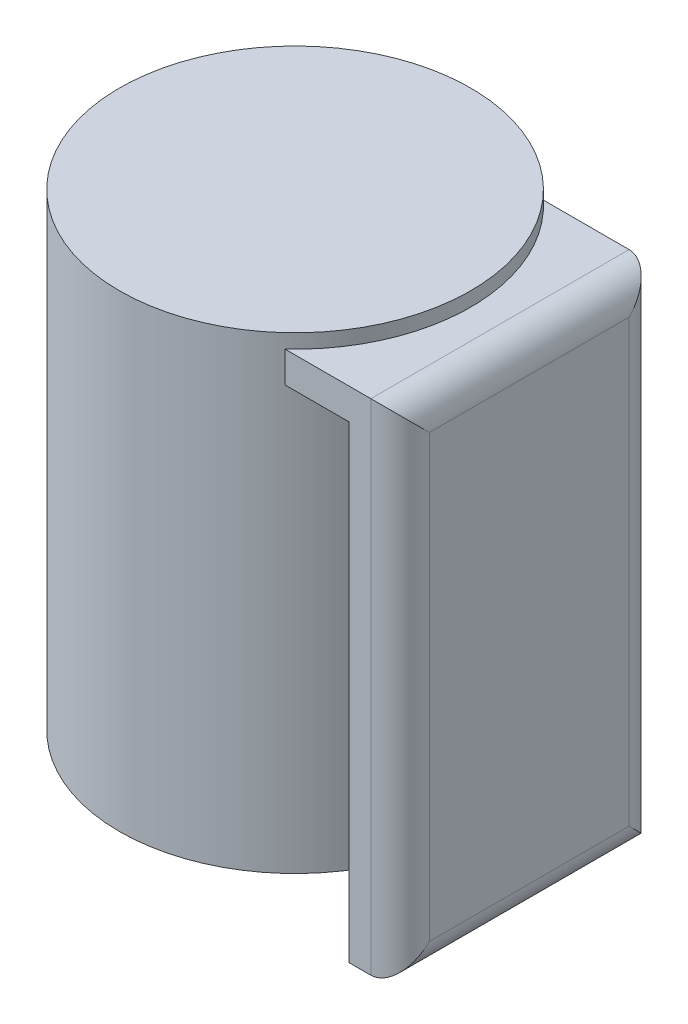
ISO-10303-21;
HEADER;
FILE_DESCRIPTION(('STEP AP214'),'2;1');
FILE_NAME('part.step','',(''),(''),'','','');
FILE_SCHEMA(('AUTOMOTIVE_DESIGN { 1 0 10303 214 1 1 1 1 }'));
ENDSEC;
DATA;
#1=APPLICATION_CONTEXT('core data for automotive mechanical design processes');
#2=APPLICATION_PROTOCOL_DEFINITION('international standard','automotive_design',2000,#1);
#3=PRODUCT_CONTEXT('',#1,'mechanical');
#4=PRODUCT('Part','Part','',(#3));
#5=PRODUCT_RELATED_PRODUCT_CATEGORY('part','',(#4));
#6=PRODUCT_DEFINITION_FORMATION('','',#4);
#7=PRODUCT_DEFINITION_CONTEXT('part definition',#1,'design');
#8=PRODUCT_DEFINITION('design','',#6,#7);
#9=PRODUCT_DEFINITION_SHAPE('','',#8);
#10=(LENGTH_UNIT() NAMED_UNIT(*) SI_UNIT(.MILLI.,.METRE.));
#11=(NAMED_UNIT(*) PLANE_ANGLE_UNIT() SI_UNIT($,.RADIAN.));
#12=(NAMED_UNIT(*) SI_UNIT($,.STERADIAN.) SOLID_ANGLE_UNIT());
#13=UNCERTAINTY_MEASURE_WITH_UNIT(LENGTH_MEASURE(1.E-05),#10,'distance_accuracy_value','');
#14=(GEOMETRIC_REPRESENTATION_CONTEXT(3) GLOBAL_UNCERTAINTY_ASSIGNED_CONTEXT((#13)) GLOBAL_UNIT_ASSIGNED_CONTEXT((#10,
#11,#12)) REPRESENTATION_CONTEXT('',''));
#15=CARTESIAN_POINT('',(0.,0.,0.));
#16=DIRECTION('',(0.,0.,1.));
#17=DIRECTION('',(1.,0.,0.));
#18=AXIS2_PLACEMENT_3D('',#15,#16,#17);
#19=CARTESIAN_POINT('',(20.,36.135040049326,11.0281070926566));
#20=DIRECTION('',(0.,1.,0.));
#21=DIRECTION('',(0.,0.,1.));
#22=AXIS2_PLACEMENT_3D('',#19,#20,#21);
#23=PLANE('',#22);
#24=DIRECTION('',(0.,0.,-1.));
#25=VECTOR('',#24,1.);
#26=CARTESIAN_POINT('',(15.6143604643596,36.135040049326,11.0281070926566));
#27=LINE('',#26,#25);
#28=CARTESIAN_POINT('',(15.6143604643596,36.135040049326,11.0281070926566));
#29=VERTEX_POINT('',#28);
#30=CARTESIAN_POINT('',(15.6143604643596,36.135040049326,-11.0281070926566));
#31=VERTEX_POINT('',#30);
#32=EDGE_CURVE('E106',#29,#31,#27,.T.);
#33=ORIENTED_EDGE('',*,*,#32,.F.);
#34=DIRECTION('',(-1.,0.,0.));
#35=VECTOR('',#34,1.);
#36=CARTESIAN_POINT('',(20.,36.135040049326,11.0281070926566));
#37=LINE('',#36,#35);
#38=CARTESIAN_POINT('',(10.1676375797378,36.135040049326,11.0281070926566));
#39=VERTEX_POINT('',#38);
#40=EDGE_CURVE('E112',#29,#39,#37,.T.);
#41=ORIENTED_EDGE('',*,*,#40,.T.);
#42=CARTESIAN_POINT('',(0.,36.135040049326,0.));
#43=DIRECTION('',(0.,1.,0.));
#44=DIRECTION('',(0.,0.,1.));
#45=AXIS2_PLACEMENT_3D('',#42,#43,#44);
#46=CIRCLE('',#45,15.);
#47=CARTESIAN_POINT('',(10.1676375797378,36.135040049326,-11.0281070926566));
#48=VERTEX_POINT('',#47);
#49=EDGE_CURVE('E145',#39,#48,#46,.T.);
#50=ORIENTED_EDGE('',*,*,#49,.T.);
#51=DIRECTION('',(-1.,0.,0.));
#52=VECTOR('',#51,1.);
#53=CARTESIAN_POINT('',(20.,36.135040049326,-11.0281070926566));
#54=LINE('',#53,#52);
#55=EDGE_CURVE('E115',#31,#48,#54,.T.);
#56=ORIENTED_EDGE('',*,*,#55,.F.);
#57=EDGE_LOOP('',(#33,#41,#50,#56));
#58=FACE_BOUND('',#57,.T.);
#59=ADVANCED_FACE('F32',(#58),#23,.F.);
#60=CARTESIAN_POINT('',(0.,35.,0.));
#61=DIRECTION('',(0.,-1.,0.));
#62=DIRECTION('',(0.,0.,-1.));
#63=AXIS2_PLACEMENT_3D('',#60,#61,#62);
#64=CYLINDRICAL_SURFACE('',#63,15.);
#65=CARTESIAN_POINT('',(0.,40.,0.));
#66=DIRECTION('',(0.,1.,0.));
#67=DIRECTION('',(0.,0.,1.));
#68=AXIS2_PLACEMENT_3D('',#65,#66,#67);
#69=CIRCLE('',#68,15.);
#70=CARTESIAN_POINT('',(0.,40.,15.));
#71=VERTEX_POINT('',#70);
#72=EDGE_CURVE('E133',#71,#71,#69,.T.);
#73=ORIENTED_EDGE('',*,*,#72,.F.);
#74=EDGE_LOOP('',(#73));
#75=FACE_BOUND('',#74,.T.);
#76=CARTESIAN_POINT('',(0.,0.,0.));
#77=DIRECTION('',(0.,1.,0.));
#78=DIRECTION('',(0.,0.,1.));
#79=AXIS2_PLACEMENT_3D('',#76,#77,#78);
#80=CIRCLE('',#79,15.);
#81=CARTESIAN_POINT('',(0.,0.,15.));
#82=VERTEX_POINT('',#81);
#83=EDGE_CURVE('E142',#82,#82,#80,.T.);
#84=ORIENTED_EDGE('',*,*,#83,.T.);
#85=EDGE_LOOP('',(#84));
#86=FACE_BOUND('',#85,.T.);
#87=DIRECTION('',(0.,-1.,0.));
#88=VECTOR('',#87,1.);
#89=CARTESIAN_POINT('',(10.1676375797378,35.,-11.0281070926566));
#90=LINE('',#89,#88);
#91=CARTESIAN_POINT('',(10.1676375797378,38.7849802327188,-11.0281070926566));
#92=VERTEX_POINT('',#91);
#93=EDGE_CURVE('E153',#48,#92,#90,.F.);
#94=ORIENTED_EDGE('',*,*,#93,.F.);
#95=ORIENTED_EDGE('',*,*,#49,.F.);
#96=DIRECTION('',(0.,-1.,0.));
#97=VECTOR('',#96,1.);
#98=CARTESIAN_POINT('',(10.1676375797378,35.,11.0281070926566));
#99=LINE('',#98,#97);
#100=CARTESIAN_POINT('',(10.1676375797378,38.7849802327188,11.0281070926566));
#101=VERTEX_POINT('',#100);
#102=EDGE_CURVE('E148',#101,#39,#99,.T.);
#103=ORIENTED_EDGE('',*,*,#102,.F.);
#104=CARTESIAN_POINT('',(0.,38.7849802327188,0.));
#105=DIRECTION('',(0.,-1.,0.));
#106=DIRECTION('',(0.,0.,-1.));
#107=AXIS2_PLACEMENT_3D('',#104,#105,#106);
#108=CIRCLE('',#107,15.);
#109=EDGE_CURVE('E150',#92,#101,#108,.T.);
#110=ORIENTED_EDGE('',*,*,#109,.F.);
#111=EDGE_LOOP('',(#94,#95,#103,#110));
#112=FACE_BOUND('',#111,.T.);
#113=ADVANCED_FACE('F200',(#75,#86,#112),#64,.T.);
#114=CARTESIAN_POINT('',(0.,0.,0.));
#115=DIRECTION('',(0.,1.,0.));
#116=DIRECTION('',(0.,0.,1.));
#117=AXIS2_PLACEMENT_3D('',#114,#115,#116);
#118=PLANE('',#117);
#119=ORIENTED_EDGE('',*,*,#83,.F.);
#120=EDGE_LOOP('',(#119));
#121=FACE_BOUND('',#120,.T.);
#122=CARTESIAN_POINT('',(0.,0.,0.));
#123=DIRECTION('',(0.,1.,0.));
#124=DIRECTION('',(0.,0.,1.));
#125=AXIS2_PLACEMENT_3D('',#122,#123,#124);
#126=CIRCLE('',#125,12.5);
#127=CARTESIAN_POINT('',(0.,0.,12.5));
#128=VERTEX_POINT('',#127);
#129=EDGE_CURVE('E139',#128,#128,#126,.T.);
#130=ORIENTED_EDGE('',*,*,#129,.T.);
#131=EDGE_LOOP('',(#130));
#132=FACE_BOUND('',#131,.T.);
#133=ADVANCED_FACE('F206',(#121,#132),#118,.F.);
#134=CARTESIAN_POINT('',(0.,35.,0.));
#135=DIRECTION('',(0.,-1.,0.));
#136=DIRECTION('',(0.,0.,-1.));
#137=AXIS2_PLACEMENT_3D('',#134,#135,#136);
#138=CYLINDRICAL_SURFACE('',#137,12.5);
#139=CARTESIAN_POINT('',(0.,35.,0.));
#140=DIRECTION('',(0.,1.,0.));
#141=DIRECTION('',(0.,0.,1.));
#142=AXIS2_PLACEMENT_3D('',#139,#140,#141);
#143=CIRCLE('',#142,12.5);
#144=CARTESIAN_POINT('',(0.,35.,12.5));
#145=VERTEX_POINT('',#144);
#146=EDGE_CURVE('E136',#145,#145,#143,.T.);
#147=ORIENTED_EDGE('',*,*,#146,.T.);
#148=EDGE_LOOP('',(#147));
#149=FACE_BOUND('',#148,.T.);
#150=ORIENTED_EDGE('',*,*,#129,.F.);
#151=EDGE_LOOP('',(#150));
#152=FACE_BOUND('',#151,.T.);
#153=ADVANCED_FACE('F228',(#149,#152),#138,.F.);
#154=CARTESIAN_POINT('',(0.,35.,0.));
#155=DIRECTION('',(0.,1.,0.));
#156=DIRECTION('',(0.,0.,1.));
#157=AXIS2_PLACEMENT_3D('',#154,#155,#156);
#158=PLANE('',#157);
#159=ORIENTED_EDGE('',*,*,#146,.F.);
#160=EDGE_LOOP('',(#159));
#161=FACE_BOUND('',#160,.T.);
#162=ADVANCED_FACE('F224',(#161),#158,.F.);
#163=CARTESIAN_POINT('',(0.,40.,0.));
#164=DIRECTION('',(0.,1.,0.));
#165=DIRECTION('',(0.,0.,1.));
#166=AXIS2_PLACEMENT_3D('',#163,#164,#165);
#167=PLANE('',#166);
#168=ORIENTED_EDGE('',*,*,#72,.T.);
#169=EDGE_LOOP('',(#168));
#170=FACE_BOUND('',#169,.T.);
#171=ADVANCED_FACE('F220',(#170),#167,.T.);
#172=CARTESIAN_POINT('',(20.,38.7849802327188,-11.0281070926566));
#173=DIRECTION('',(0.,0.,1.));
#174=DIRECTION('',(1.,0.,0.));
#175=AXIS2_PLACEMENT_3D('',#172,#173,#174);
#176=PLANE('',#175);
#177=DIRECTION('',(-1.,0.,0.));
#178=VECTOR('',#177,1.);
#179=CARTESIAN_POINT('',(20.,38.7849802327188,-11.0281070926566));
#180=LINE('',#179,#178);
#181=CARTESIAN_POINT('',(17.5,38.7849802327188,-11.0281070926566));
#182=VERTEX_POINT('',#181);
#183=EDGE_CURVE('E131',#182,#92,#180,.T.);
#184=ORIENTED_EDGE('',*,*,#183,.F.);
#185=DIRECTION('',(0.,1.,0.));
#186=VECTOR('',#185,1.);
#187=CARTESIAN_POINT('',(17.5,-3.86495995067399,-11.0281070926566));
#188=LINE('',#187,#186);
#189=CARTESIAN_POINT('',(17.5,-3.86495995067399,-11.0281070926566));
#190=VERTEX_POINT('',#189);
#191=EDGE_CURVE('E11',#182,#190,#188,.F.);
#192=ORIENTED_EDGE('',*,*,#191,.T.);
#193=DIRECTION('',(1.,0.,0.));
#194=VECTOR('',#193,1.);
#195=CARTESIAN_POINT('',(15.6143604643596,-3.86495995067399,-11.0281070926566));
#196=LINE('',#195,#194);
#197=CARTESIAN_POINT('',(15.6143604643596,-3.86495995067399,-11.0281070926566));
#198=VERTEX_POINT('',#197);
#199=EDGE_CURVE('E121',#198,#190,#196,.T.);
#200=ORIENTED_EDGE('',*,*,#199,.F.);
#201=DIRECTION('',(0.,1.,0.));
#202=VECTOR('',#201,1.);
#203=CARTESIAN_POINT('',(15.6143604643596,-3.86495995067399,-11.0281070926566));
#204=LINE('',#203,#202);
#205=EDGE_CURVE('E116',#198,#31,#204,.T.);
#206=ORIENTED_EDGE('',*,*,#205,.T.);
#207=ORIENTED_EDGE('',*,*,#55,.T.);
#208=ORIENTED_EDGE('',*,*,#93,.T.);
#209=EDGE_LOOP('',(#184,#192,#200,#206,#207,#208));
#210=FACE_BOUND('',#209,.T.);
#211=ADVANCED_FACE('F215',(#210),#176,.F.);
#212=CARTESIAN_POINT('',(20.,38.7849802327188,11.0281070926566));
#213=DIRECTION('',(0.,0.,-1.));
#214=DIRECTION('',(-1.,0.,0.));
#215=AXIS2_PLACEMENT_3D('',#212,#213,#214);
#216=PLANE('',#215);
#217=DIRECTION('',(-1.,0.,0.));
#218=VECTOR('',#217,1.);
#219=CARTESIAN_POINT('',(15.6143604643596,-3.86495995067399,11.0281070926566));
#220=LINE('',#219,#218);
#221=CARTESIAN_POINT('',(17.5,-3.86495995067399,11.0281070926566));
#222=VERTEX_POINT('',#221);
#223=CARTESIAN_POINT('',(15.6143604643596,-3.86495995067399,11.0281070926566));
#224=VERTEX_POINT('',#223);
#225=EDGE_CURVE('E97',#222,#224,#220,.T.);
#226=ORIENTED_EDGE('',*,*,#225,.F.);
#227=DIRECTION('',(0.,-1.,0.));
#228=VECTOR('',#227,1.);
#229=CARTESIAN_POINT('',(17.5,38.7849802327188,11.0281070926566));
#230=LINE('',#229,#228);
#231=CARTESIAN_POINT('',(17.5,38.7849802327188,11.0281070926566));
#232=VERTEX_POINT('',#231);
#233=EDGE_CURVE('E56',#222,#232,#230,.F.);
#234=ORIENTED_EDGE('',*,*,#233,.T.);
#235=DIRECTION('',(-1.,0.,0.));
#236=VECTOR('',#235,1.);
#237=CARTESIAN_POINT('',(20.,38.7849802327188,11.0281070926566));
#238=LINE('',#237,#236);
#239=EDGE_CURVE('E129',#232,#101,#238,.T.);
#240=ORIENTED_EDGE('',*,*,#239,.T.);
#241=ORIENTED_EDGE('',*,*,#102,.T.);
#242=ORIENTED_EDGE('',*,*,#40,.F.);
#243=DIRECTION('',(0.,1.,0.));
#244=VECTOR('',#243,1.);
#245=CARTESIAN_POINT('',(15.6143604643596,-3.86495995067399,11.0281070926566));
#246=LINE('',#245,#244);
#247=EDGE_CURVE('E109',#224,#29,#246,.T.);
#248=ORIENTED_EDGE('',*,*,#247,.F.);
#249=EDGE_LOOP('',(#226,#234,#240,#241,#242,#248));
#250=FACE_BOUND('',#249,.T.);
#251=ADVANCED_FACE('F110',(#250),#216,.F.);
#252=CARTESIAN_POINT('',(20.,38.7849802327188,11.0281070926566));
#253=DIRECTION('',(0.,-1.,0.));
#254=DIRECTION('',(0.,0.,-1.));
#255=AXIS2_PLACEMENT_3D('',#252,#253,#254);
#256=PLANE('',#255);
#257=ORIENTED_EDGE('',*,*,#239,.F.);
#258=DIRECTION('',(0.,0.,1.));
#259=VECTOR('',#258,1.);
#260=CARTESIAN_POINT('',(17.5,38.7849802327188,-11.0281070926566));
#261=LINE('',#260,#259);
#262=EDGE_CURVE('E41',#232,#182,#261,.F.);
#263=ORIENTED_EDGE('',*,*,#262,.T.);
#264=ORIENTED_EDGE('',*,*,#183,.T.);
#265=ORIENTED_EDGE('',*,*,#109,.T.);
#266=EDGE_LOOP('',(#257,#263,#264,#265));
#267=FACE_BOUND('',#266,.T.);
#268=ADVANCED_FACE('F214',(#267),#256,.F.);
#269=CARTESIAN_POINT('',(20.,0.,0.));
#270=DIRECTION('',(1.,0.,0.));
#271=DIRECTION('',(0.,0.,-1.));
#272=AXIS2_PLACEMENT_3D('',#269,#270,#271);
#273=PLANE('',#272);
#274=DIRECTION('',(0.,-1.,0.));
#275=VECTOR('',#274,1.);
#276=CARTESIAN_POINT('',(20.,-3.86495995067399,8.52810709265665));
#277=LINE('',#276,#275);
#278=CARTESIAN_POINT('',(20.,36.2849802327188,8.52810709265665));
#279=VERTEX_POINT('',#278);
#280=CARTESIAN_POINT('',(20.,-1.36495995067399,8.52810709265665));
#281=VERTEX_POINT('',#280);
#282=EDGE_CURVE('E161',#279,#281,#277,.T.);
#283=ORIENTED_EDGE('',*,*,#282,.T.);
#284=DIRECTION('',(0.,0.,1.));
#285=VECTOR('',#284,1.);
#286=CARTESIAN_POINT('',(20.,-1.36495995067399,0.));
#287=LINE('',#286,#285);
#288=CARTESIAN_POINT('',(20.,-1.36495995067399,-8.52810709265665));
#289=VERTEX_POINT('',#288);
#290=EDGE_CURVE('E163',#281,#289,#287,.F.);
#291=ORIENTED_EDGE('',*,*,#290,.T.);
#292=DIRECTION('',(0.,1.,0.));
#293=VECTOR('',#292,1.);
#294=CARTESIAN_POINT('',(20.,38.7849802327188,-8.52810709265665));
#295=LINE('',#294,#293);
#296=CARTESIAN_POINT('',(20.,36.2849802327188,-8.52810709265665));
#297=VERTEX_POINT('',#296);
#298=EDGE_CURVE('E157',#289,#297,#295,.T.);
#299=ORIENTED_EDGE('',*,*,#298,.T.);
#300=DIRECTION('',(0.,0.,1.));
#301=VECTOR('',#300,1.);
#302=CARTESIAN_POINT('',(20.,36.2849802327188,11.0281070926566));
#303=LINE('',#302,#301);
#304=EDGE_CURVE('E159',#297,#279,#303,.T.);
#305=ORIENTED_EDGE('',*,*,#304,.T.);
#306=EDGE_LOOP('',(#283,#291,#299,#305));
#307=FACE_BOUND('',#306,.T.);
#308=ADVANCED_FACE('F186',(#307),#273,.T.);
#309=CARTESIAN_POINT('',(15.6143604643596,-3.86495995067399,11.0281070926566));
#310=DIRECTION('',(1.,0.,0.));
#311=DIRECTION('',(0.,0.,-1.));
#312=AXIS2_PLACEMENT_3D('',#309,#310,#311);
#313=PLANE('',#312);
#314=ORIENTED_EDGE('',*,*,#32,.T.);
#315=ORIENTED_EDGE('',*,*,#205,.F.);
#316=DIRECTION('',(0.,0.,-1.));
#317=VECTOR('',#316,1.);
#318=CARTESIAN_POINT('',(15.6143604643596,-3.86495995067399,11.0281070926566));
#319=LINE('',#318,#317);
#320=EDGE_CURVE('E102',#224,#198,#319,.T.);
#321=ORIENTED_EDGE('',*,*,#320,.F.);
#322=ORIENTED_EDGE('',*,*,#247,.T.);
#323=EDGE_LOOP('',(#314,#315,#321,#322));
#324=FACE_BOUND('',#323,.T.);
#325=ADVANCED_FACE('F118',(#324),#313,.F.);
#326=CARTESIAN_POINT('',(0.,-3.86495995067399,0.));
#327=DIRECTION('',(0.,-1.,0.));
#328=DIRECTION('',(0.,0.,-1.));
#329=AXIS2_PLACEMENT_3D('',#326,#327,#328);
#330=PLANE('',#329);
#331=ORIENTED_EDGE('',*,*,#199,.T.);
#332=DIRECTION('',(0.,0.,1.));
#333=VECTOR('',#332,1.);
#334=CARTESIAN_POINT('',(17.5,-3.86495995067399,0.));
#335=LINE('',#334,#333);
#336=EDGE_CURVE('E105',#190,#222,#335,.T.);
#337=ORIENTED_EDGE('',*,*,#336,.T.);
#338=ORIENTED_EDGE('',*,*,#225,.T.);
#339=ORIENTED_EDGE('',*,*,#320,.T.);
#340=EDGE_LOOP('',(#331,#337,#338,#339));
#341=FACE_BOUND('',#340,.T.);
#342=ADVANCED_FACE('F100',(#341),#330,.T.);
#343=CARTESIAN_POINT('',(17.5,36.2849802327188,0.));
#344=DIRECTION('',(0.,0.,-1.));
#345=DIRECTION('',(-1.,0.,0.));
#346=AXIS2_PLACEMENT_3D('',#343,#344,#345);
#347=CYLINDRICAL_SURFACE('',#346,2.5);
#348=CARTESIAN_POINT('',(17.5,36.2849802327188,8.52810709265665));
#349=DIRECTION('',(0.,0.707106781186547,-0.707106781186547));
#350=DIRECTION('',(0.,-0.707106781186547,-0.707106781186547));
#351=AXIS2_PLACEMENT_3D('',#348,#349,#350);
#352=ELLIPSE('',#351,3.53553390593274,2.5);
#353=EDGE_CURVE('E171',#279,#232,#352,.F.);
#354=ORIENTED_EDGE('',*,*,#353,.F.);
#355=ORIENTED_EDGE('',*,*,#304,.F.);
#356=CARTESIAN_POINT('',(17.5,36.2849802327188,-8.52810709265665));
#357=DIRECTION('',(0.,-0.707106781186547,-0.707106781186547));
#358=DIRECTION('',(0.,-0.707106781186547,0.707106781186547));
#359=AXIS2_PLACEMENT_3D('',#356,#357,#358);
#360=ELLIPSE('',#359,3.53553390593274,2.5);
#361=EDGE_CURVE('E36',#182,#297,#360,.T.);
#362=ORIENTED_EDGE('',*,*,#361,.F.);
#363=ORIENTED_EDGE('',*,*,#262,.F.);
#364=EDGE_LOOP('',(#354,#355,#362,#363));
#365=FACE_BOUND('',#364,.T.);
#366=ADVANCED_FACE('F34',(#365),#347,.T.);
#367=CARTESIAN_POINT('',(17.5,0.,-8.52810709265665));
#368=DIRECTION('',(0.,-1.,0.));
#369=DIRECTION('',(0.,0.,-1.));
#370=AXIS2_PLACEMENT_3D('',#367,#368,#369);
#371=CYLINDRICAL_SURFACE('',#370,2.5);
#372=ORIENTED_EDGE('',*,*,#361,.T.);
#373=ORIENTED_EDGE('',*,*,#298,.F.);
#374=CARTESIAN_POINT('',(17.5,-1.36495995067399,-8.52810709265665));
#375=DIRECTION('',(0.,-0.707106781186547,0.707106781186547));
#376=DIRECTION('',(0.,-0.707106781186547,-0.707106781186547));
#377=AXIS2_PLACEMENT_3D('',#374,#375,#376);
#378=ELLIPSE('',#377,3.53553390593274,2.5);
#379=EDGE_CURVE('E170',#190,#289,#378,.T.);
#380=ORIENTED_EDGE('',*,*,#379,.F.);
#381=ORIENTED_EDGE('',*,*,#191,.F.);
#382=EDGE_LOOP('',(#372,#373,#380,#381));
#383=FACE_BOUND('',#382,.T.);
#384=ADVANCED_FACE('F181',(#383),#371,.T.);
#385=CARTESIAN_POINT('',(17.5,0.,8.52810709265665));
#386=DIRECTION('',(0.,1.,0.));
#387=DIRECTION('',(0.,0.,1.));
#388=AXIS2_PLACEMENT_3D('',#385,#386,#387);
#389=CYLINDRICAL_SURFACE('',#388,2.5);
#390=ORIENTED_EDGE('',*,*,#353,.T.);
#391=ORIENTED_EDGE('',*,*,#233,.F.);
#392=CARTESIAN_POINT('',(17.5,-1.36495995067399,8.52810709265665));
#393=DIRECTION('',(0.,0.707106781186547,0.707106781186547));
#394=DIRECTION('',(0.,0.707106781186547,-0.707106781186547));
#395=AXIS2_PLACEMENT_3D('',#392,#393,#394);
#396=ELLIPSE('',#395,3.53553390593274,2.5);
#397=EDGE_CURVE('E168',#281,#222,#396,.F.);
#398=ORIENTED_EDGE('',*,*,#397,.F.);
#399=ORIENTED_EDGE('',*,*,#282,.F.);
#400=EDGE_LOOP('',(#390,#391,#398,#399));
#401=FACE_BOUND('',#400,.T.);
#402=ADVANCED_FACE('F191',(#401),#389,.T.);
#403=CARTESIAN_POINT('',(17.5,-1.36495995067399,0.));
#404=DIRECTION('',(0.,0.,1.));
#405=DIRECTION('',(1.,0.,0.));
#406=AXIS2_PLACEMENT_3D('',#403,#404,#405);
#407=CYLINDRICAL_SURFACE('',#406,2.5);
#408=ORIENTED_EDGE('',*,*,#379,.T.);
#409=ORIENTED_EDGE('',*,*,#290,.F.);
#410=ORIENTED_EDGE('',*,*,#397,.T.);
#411=ORIENTED_EDGE('',*,*,#336,.F.);
#412=EDGE_LOOP('',(#408,#409,#410,#411));
#413=FACE_BOUND('',#412,.T.);
#414=ADVANCED_FACE('F190',(#413),#407,.T.);
#415=CLOSED_SHELL('',(#59,#113,#133,#153,#162,#171,#211,#251,#268,#308,#325,#342,#366,#384,#402,#414));
#416=MANIFOLD_SOLID_BREP('B2',#415);
#417=ADVANCED_BREP_SHAPE_REPRESENTATION('',(#18,#416),#14);
#418=SHAPE_DEFINITION_REPRESENTATION(#9,#417);
ENDSEC;
END-ISO-10303-21;
